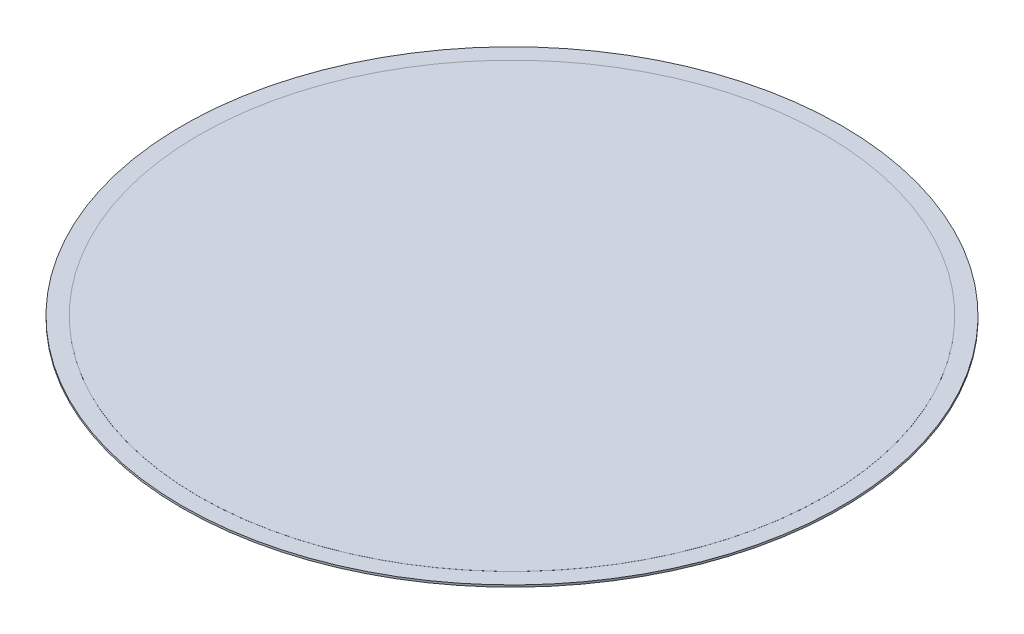
ISO-10303-21;
HEADER;
FILE_DESCRIPTION(('STEP AP214'),'2;1');
FILE_NAME('part.step','',(''),(''),'','','');
FILE_SCHEMA(('AUTOMOTIVE_DESIGN { 1 0 10303 214 1 1 1 1 }'));
ENDSEC;
DATA;
#1=APPLICATION_CONTEXT('core data for automotive mechanical design processes');
#2=APPLICATION_PROTOCOL_DEFINITION('international standard','automotive_design',2000,#1);
#3=PRODUCT_CONTEXT('',#1,'mechanical');
#4=PRODUCT('Part','Part','',(#3));
#5=PRODUCT_RELATED_PRODUCT_CATEGORY('part','',(#4));
#6=PRODUCT_DEFINITION_FORMATION('','',#4);
#7=PRODUCT_DEFINITION_CONTEXT('part definition',#1,'design');
#8=PRODUCT_DEFINITION('design','',#6,#7);
#9=PRODUCT_DEFINITION_SHAPE('','',#8);
#10=(LENGTH_UNIT() NAMED_UNIT(*) SI_UNIT(.MILLI.,.METRE.));
#11=(NAMED_UNIT(*) PLANE_ANGLE_UNIT() SI_UNIT($,.RADIAN.));
#12=(NAMED_UNIT(*) SI_UNIT($,.STERADIAN.) SOLID_ANGLE_UNIT());
#13=UNCERTAINTY_MEASURE_WITH_UNIT(LENGTH_MEASURE(1.E-05),#10,'distance_accuracy_value','');
#14=(GEOMETRIC_REPRESENTATION_CONTEXT(3) GLOBAL_UNCERTAINTY_ASSIGNED_CONTEXT((#13)) GLOBAL_UNIT_ASSIGNED_CONTEXT((#10,
#11,#12)) REPRESENTATION_CONTEXT('',''));
#15=CARTESIAN_POINT('',(0.,0.,0.));
#16=DIRECTION('',(0.,0.,1.));
#17=DIRECTION('',(1.,0.,0.));
#18=AXIS2_PLACEMENT_3D('',#15,#16,#17);
#19=CARTESIAN_POINT('',(0.,3.,0.));
#20=DIRECTION('',(0.,-1.,0.));
#21=DIRECTION('',(0.,0.,-1.));
#22=AXIS2_PLACEMENT_3D('',#19,#20,#21);
#23=CYLINDRICAL_SURFACE('',#22,500.);
#24=CARTESIAN_POINT('',(0.,3.,0.));
#25=DIRECTION('',(0.,1.,0.));
#26=DIRECTION('',(0.,0.,1.));
#27=AXIS2_PLACEMENT_3D('',#24,#25,#26);
#28=CIRCLE('',#27,500.);
#29=CARTESIAN_POINT('',(0.,3.,500.));
#30=VERTEX_POINT('',#29);
#31=EDGE_CURVE('E40',#30,#30,#28,.T.);
#32=ORIENTED_EDGE('',*,*,#31,.F.);
#33=EDGE_LOOP('',(#32));
#34=FACE_BOUND('',#33,.T.);
#35=CARTESIAN_POINT('',(0.,0.,0.));
#36=DIRECTION('',(0.,1.,0.));
#37=DIRECTION('',(0.,0.,1.));
#38=AXIS2_PLACEMENT_3D('',#35,#36,#37);
#39=CIRCLE('',#38,500.);
#40=CARTESIAN_POINT('',(0.,0.,500.));
#41=VERTEX_POINT('',#40);
#42=EDGE_CURVE('E36',#41,#41,#39,.T.);
#43=ORIENTED_EDGE('',*,*,#42,.T.);
#44=EDGE_LOOP('',(#43));
#45=FACE_BOUND('',#44,.T.);
#46=ADVANCED_FACE('F33',(#34,#45),#23,.T.);
#47=CARTESIAN_POINT('',(0.,3.,0.));
#48=DIRECTION('',(0.,1.,0.));
#49=DIRECTION('',(0.,0.,1.));
#50=AXIS2_PLACEMENT_3D('',#47,#48,#49);
#51=PLANE('',#50);
#52=CARTESIAN_POINT('',(0.,3.,0.));
#53=DIRECTION('',(0.,1.,0.));
#54=DIRECTION('',(0.,0.,1.));
#55=AXIS2_PLACEMENT_3D('',#52,#53,#54);
#56=CIRCLE('',#55,475.);
#57=CARTESIAN_POINT('',(0.,3.,475.));
#58=VERTEX_POINT('',#57);
#59=EDGE_CURVE('E10',#58,#58,#56,.T.);
#60=ORIENTED_EDGE('',*,*,#59,.F.);
#61=EDGE_LOOP('',(#60));
#62=FACE_BOUND('',#61,.T.);
#63=ORIENTED_EDGE('',*,*,#31,.T.);
#64=EDGE_LOOP('',(#63));
#65=FACE_BOUND('',#64,.T.);
#66=ADVANCED_FACE('F57',(#62,#65),#51,.T.);
#67=CARTESIAN_POINT('',(0.,0.,0.));
#68=DIRECTION('',(0.,1.,0.));
#69=DIRECTION('',(0.,0.,1.));
#70=AXIS2_PLACEMENT_3D('',#67,#68,#69);
#71=PLANE('',#70);
#72=ORIENTED_EDGE('',*,*,#42,.F.);
#73=EDGE_LOOP('',(#72));
#74=FACE_BOUND('',#73,.T.);
#75=ADVANCED_FACE('F54',(#74),#71,.F.);
#76=CARTESIAN_POINT('',(0.,3.1,0.));
#77=DIRECTION('',(0.,-1.,0.));
#78=DIRECTION('',(0.,0.,-1.));
#79=AXIS2_PLACEMENT_3D('',#76,#77,#78);
#80=CYLINDRICAL_SURFACE('',#79,475.);
#81=CARTESIAN_POINT('',(0.,3.1,0.));
#82=DIRECTION('',(0.,1.,0.));
#83=DIRECTION('',(0.,0.,1.));
#84=AXIS2_PLACEMENT_3D('',#81,#82,#83);
#85=CIRCLE('',#84,475.);
#86=CARTESIAN_POINT('',(0.,3.1,475.));
#87=VERTEX_POINT('',#86);
#88=EDGE_CURVE('E46',#87,#87,#85,.T.);
#89=ORIENTED_EDGE('',*,*,#88,.F.);
#90=EDGE_LOOP('',(#89));
#91=FACE_BOUND('',#90,.T.);
#92=ORIENTED_EDGE('',*,*,#59,.T.);
#93=EDGE_LOOP('',(#92));
#94=FACE_BOUND('',#93,.T.);
#95=ADVANCED_FACE('F56',(#91,#94),#80,.T.);
#96=CARTESIAN_POINT('',(0.,3.1,0.));
#97=DIRECTION('',(0.,1.,0.));
#98=DIRECTION('',(0.,0.,1.));
#99=AXIS2_PLACEMENT_3D('',#96,#97,#98);
#100=PLANE('',#99);
#101=ORIENTED_EDGE('',*,*,#88,.T.);
#102=EDGE_LOOP('',(#101));
#103=FACE_BOUND('',#102,.T.);
#104=ADVANCED_FACE('F62',(#103),#100,.T.);
#105=CLOSED_SHELL('',(#46,#66,#75,#95,#104));
#106=MANIFOLD_SOLID_BREP('B2',#105);
#107=ADVANCED_BREP_SHAPE_REPRESENTATION('',(#18,#106),#14);
#108=SHAPE_DEFINITION_REPRESENTATION(#9,#107);
ENDSEC;
END-ISO-10303-21;
